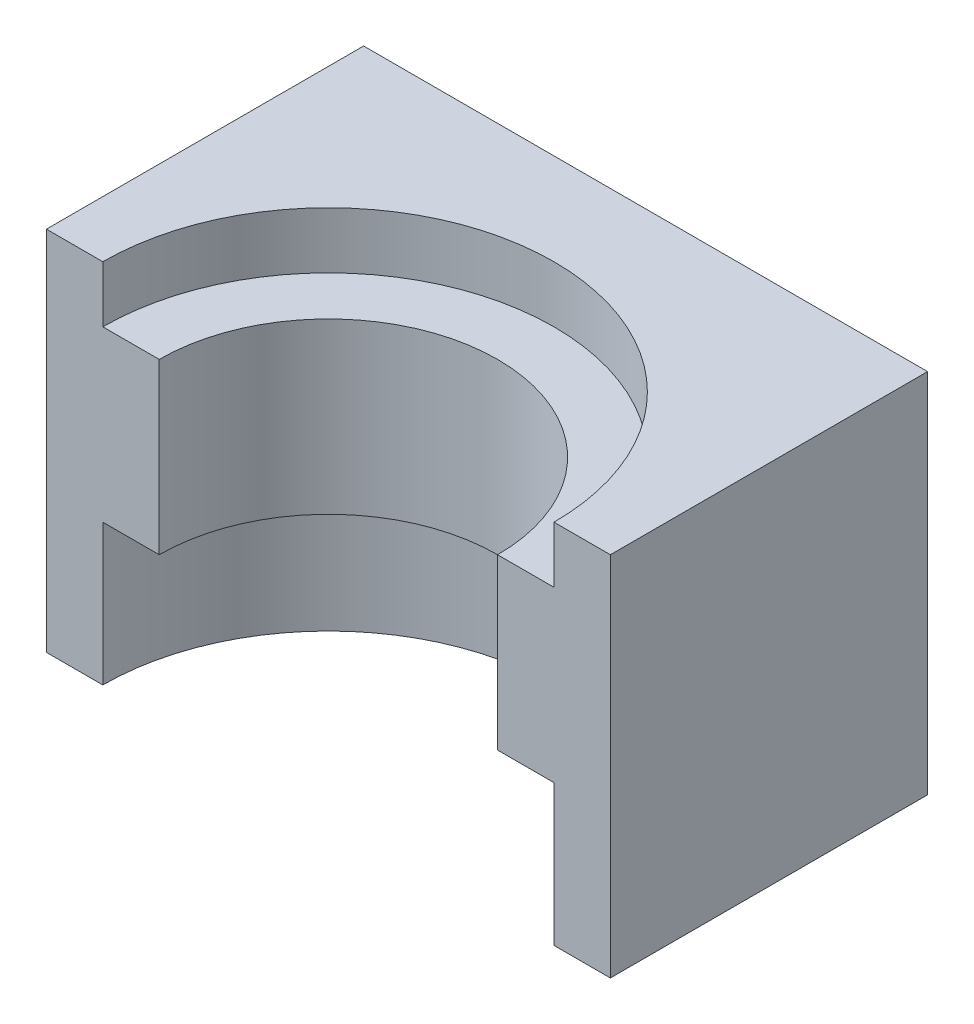
ISO-10303-21;
HEADER;
FILE_DESCRIPTION(('STEP AP214'),'2;1');
FILE_NAME('part.step','',(''),(''),'','','');
FILE_SCHEMA(('AUTOMOTIVE_DESIGN { 1 0 10303 214 1 1 1 1 }'));
ENDSEC;
DATA;
#1=APPLICATION_CONTEXT('core data for automotive mechanical design processes');
#2=APPLICATION_PROTOCOL_DEFINITION('international standard','automotive_design',2000,#1);
#3=PRODUCT_CONTEXT('',#1,'mechanical');
#4=PRODUCT('Part','Part','',(#3));
#5=PRODUCT_RELATED_PRODUCT_CATEGORY('part','',(#4));
#6=PRODUCT_DEFINITION_FORMATION('','',#4);
#7=PRODUCT_DEFINITION_CONTEXT('part definition',#1,'design');
#8=PRODUCT_DEFINITION('design','',#6,#7);
#9=PRODUCT_DEFINITION_SHAPE('','',#8);
#10=(LENGTH_UNIT() NAMED_UNIT(*) SI_UNIT(.MILLI.,.METRE.));
#11=(NAMED_UNIT(*) PLANE_ANGLE_UNIT() SI_UNIT($,.RADIAN.));
#12=(NAMED_UNIT(*) SI_UNIT($,.STERADIAN.) SOLID_ANGLE_UNIT());
#13=UNCERTAINTY_MEASURE_WITH_UNIT(LENGTH_MEASURE(1.E-05),#10,'distance_accuracy_value','');
#14=(GEOMETRIC_REPRESENTATION_CONTEXT(3) GLOBAL_UNCERTAINTY_ASSIGNED_CONTEXT((#13)) GLOBAL_UNIT_ASSIGNED_CONTEXT((#10,
#11,#12)) REPRESENTATION_CONTEXT('',''));
#15=CARTESIAN_POINT('',(0.,0.,0.));
#16=DIRECTION('',(0.,0.,1.));
#17=DIRECTION('',(1.,0.,0.));
#18=AXIS2_PLACEMENT_3D('',#15,#16,#17);
#19=CARTESIAN_POINT('',(10.,11.,-8.75));
#20=DIRECTION('',(0.,1.,0.));
#21=DIRECTION('',(0.,0.,1.));
#22=AXIS2_PLACEMENT_3D('',#19,#20,#21);
#23=PLANE('',#22);
#24=CARTESIAN_POINT('',(10.,11.,-8.75));
#25=DIRECTION('',(0.,-1.,0.));
#26=DIRECTION('',(0.,0.,1.));
#27=AXIS2_PLACEMENT_3D('',#24,#25,#26);
#28=CIRCLE('',#27,8.);
#29=CARTESIAN_POINT('',(2.,11.,-8.75));
#30=VERTEX_POINT('',#29);
#31=CARTESIAN_POINT('',(18.,11.,-8.75));
#32=VERTEX_POINT('',#31);
#33=EDGE_CURVE('E50',#30,#32,#28,.T.);
#34=ORIENTED_EDGE('',*,*,#33,.F.);
#35=DIRECTION('',(1.,0.,0.));
#36=VECTOR('',#35,1.);
#37=CARTESIAN_POINT('',(0.,11.,-8.75));
#38=LINE('',#37,#36);
#39=CARTESIAN_POINT('',(4.,11.,-8.75));
#40=VERTEX_POINT('',#39);
#41=EDGE_CURVE('E147',#30,#40,#38,.T.);
#42=ORIENTED_EDGE('',*,*,#41,.T.);
#43=CARTESIAN_POINT('',(10.,11.,-8.75));
#44=DIRECTION('',(0.,-1.,0.));
#45=DIRECTION('',(0.,0.,1.));
#46=AXIS2_PLACEMENT_3D('',#43,#44,#45);
#47=CIRCLE('',#46,6.);
#48=CARTESIAN_POINT('',(16.,11.,-8.75));
#49=VERTEX_POINT('',#48);
#50=EDGE_CURVE('E155',#40,#49,#47,.T.);
#51=ORIENTED_EDGE('',*,*,#50,.T.);
#52=DIRECTION('',(1.,0.,0.));
#53=VECTOR('',#52,1.);
#54=CARTESIAN_POINT('',(16.,11.,-8.75));
#55=LINE('',#54,#53);
#56=EDGE_CURVE('E143',#49,#32,#55,.T.);
#57=ORIENTED_EDGE('',*,*,#56,.T.);
#58=EDGE_LOOP('',(#34,#42,#51,#57));
#59=FACE_BOUND('',#58,.T.);
#60=ADVANCED_FACE('F35',(#59),#23,.T.);
#61=CARTESIAN_POINT('',(10.,5.,-8.75));
#62=DIRECTION('',(0.,-1.,0.));
#63=DIRECTION('',(0.,0.,-1.));
#64=AXIS2_PLACEMENT_3D('',#61,#62,#63);
#65=CYLINDRICAL_SURFACE('',#64,8.);
#66=CARTESIAN_POINT('',(10.,0.,-8.75));
#67=DIRECTION('',(0.,-1.,0.));
#68=DIRECTION('',(0.,0.,1.));
#69=AXIS2_PLACEMENT_3D('',#66,#67,#68);
#70=CIRCLE('',#69,8.);
#71=CARTESIAN_POINT('',(2.,0.,-8.75));
#72=VERTEX_POINT('',#71);
#73=CARTESIAN_POINT('',(18.,0.,-8.75));
#74=VERTEX_POINT('',#73);
#75=EDGE_CURVE('E107',#72,#74,#70,.T.);
#76=ORIENTED_EDGE('',*,*,#75,.T.);
#77=DIRECTION('',(0.,-1.,0.));
#78=VECTOR('',#77,1.);
#79=CARTESIAN_POINT('',(18.,5.,-8.75));
#80=LINE('',#79,#78);
#81=CARTESIAN_POINT('',(18.,5.,-8.75));
#82=VERTEX_POINT('',#81);
#83=EDGE_CURVE('E11',#82,#74,#80,.T.);
#84=ORIENTED_EDGE('',*,*,#83,.F.);
#85=CARTESIAN_POINT('',(10.,5.,-8.75));
#86=DIRECTION('',(0.,-1.,0.));
#87=DIRECTION('',(0.,0.,1.));
#88=AXIS2_PLACEMENT_3D('',#85,#86,#87);
#89=CIRCLE('',#88,8.);
#90=CARTESIAN_POINT('',(2.,5.,-8.75));
#91=VERTEX_POINT('',#90);
#92=EDGE_CURVE('E108',#91,#82,#89,.T.);
#93=ORIENTED_EDGE('',*,*,#92,.F.);
#94=DIRECTION('',(0.,-1.,0.));
#95=VECTOR('',#94,1.);
#96=CARTESIAN_POINT('',(2.,5.,-8.75));
#97=LINE('',#96,#95);
#98=EDGE_CURVE('E59',#91,#72,#97,.T.);
#99=ORIENTED_EDGE('',*,*,#98,.T.);
#100=EDGE_LOOP('',(#76,#84,#93,#99));
#101=FACE_BOUND('',#100,.T.);
#102=ADVANCED_FACE('F37',(#101),#65,.F.);
#103=CARTESIAN_POINT('',(18.,5.,-8.75));
#104=DIRECTION('',(0.,0.,-1.));
#105=DIRECTION('',(-1.,0.,0.));
#106=AXIS2_PLACEMENT_3D('',#103,#104,#105);
#107=PLANE('',#106);
#108=DIRECTION('',(1.,0.,0.));
#109=VECTOR('',#108,1.);
#110=CARTESIAN_POINT('',(18.,0.,-8.75));
#111=LINE('',#110,#109);
#112=CARTESIAN_POINT('',(20.,0.,-8.75));
#113=VERTEX_POINT('',#112);
#114=EDGE_CURVE('E132',#74,#113,#111,.T.);
#115=ORIENTED_EDGE('',*,*,#114,.T.);
#116=DIRECTION('',(0.,-1.,0.));
#117=VECTOR('',#116,1.);
#118=CARTESIAN_POINT('',(20.,5.,-8.75));
#119=LINE('',#118,#117);
#120=CARTESIAN_POINT('',(20.,13.,-8.75));
#121=VERTEX_POINT('',#120);
#122=EDGE_CURVE('E43',#121,#113,#119,.T.);
#123=ORIENTED_EDGE('',*,*,#122,.F.);
#124=DIRECTION('',(1.,0.,0.));
#125=VECTOR('',#124,1.);
#126=CARTESIAN_POINT('',(18.,13.,-8.75));
#127=LINE('',#126,#125);
#128=CARTESIAN_POINT('',(18.,13.,-8.75));
#129=VERTEX_POINT('',#128);
#130=EDGE_CURVE('E170',#129,#121,#127,.T.);
#131=ORIENTED_EDGE('',*,*,#130,.F.);
#132=DIRECTION('',(0.,-1.,0.));
#133=VECTOR('',#132,1.);
#134=CARTESIAN_POINT('',(18.,13.,-8.75));
#135=LINE('',#134,#133);
#136=EDGE_CURVE('E161',#129,#32,#135,.T.);
#137=ORIENTED_EDGE('',*,*,#136,.T.);
#138=ORIENTED_EDGE('',*,*,#56,.F.);
#139=DIRECTION('',(0.,-1.,0.));
#140=VECTOR('',#139,1.);
#141=CARTESIAN_POINT('',(16.,11.,-8.75));
#142=LINE('',#141,#140);
#143=CARTESIAN_POINT('',(16.,5.,-8.75));
#144=VERTEX_POINT('',#143);
#145=EDGE_CURVE('E140',#49,#144,#142,.T.);
#146=ORIENTED_EDGE('',*,*,#145,.T.);
#147=DIRECTION('',(1.,0.,0.));
#148=VECTOR('',#147,1.);
#149=CARTESIAN_POINT('',(16.,5.,-8.75));
#150=LINE('',#149,#148);
#151=EDGE_CURVE('E144',#144,#82,#150,.T.);
#152=ORIENTED_EDGE('',*,*,#151,.T.);
#153=ORIENTED_EDGE('',*,*,#83,.T.);
#154=EDGE_LOOP('',(#115,#123,#131,#137,#138,#146,#152,#153));
#155=FACE_BOUND('',#154,.T.);
#156=ADVANCED_FACE('F206',(#155),#107,.F.);
#157=CARTESIAN_POINT('',(20.,5.,-8.75));
#158=DIRECTION('',(-1.,0.,0.));
#159=DIRECTION('',(0.,0.,1.));
#160=AXIS2_PLACEMENT_3D('',#157,#158,#159);
#161=PLANE('',#160);
#162=DIRECTION('',(0.,0.,-1.));
#163=VECTOR('',#162,1.);
#164=CARTESIAN_POINT('',(20.,0.,-8.75));
#165=LINE('',#164,#163);
#166=CARTESIAN_POINT('',(20.,0.,-20.));
#167=VERTEX_POINT('',#166);
#168=EDGE_CURVE('E125',#113,#167,#165,.T.);
#169=ORIENTED_EDGE('',*,*,#168,.T.);
#170=DIRECTION('',(0.,-1.,0.));
#171=VECTOR('',#170,1.);
#172=CARTESIAN_POINT('',(20.,5.,-20.));
#173=LINE('',#172,#171);
#174=CARTESIAN_POINT('',(20.,13.,-20.));
#175=VERTEX_POINT('',#174);
#176=EDGE_CURVE('E116',#175,#167,#173,.T.);
#177=ORIENTED_EDGE('',*,*,#176,.F.);
#178=DIRECTION('',(0.,0.,-1.));
#179=VECTOR('',#178,1.);
#180=CARTESIAN_POINT('',(20.,13.,-20.));
#181=LINE('',#180,#179);
#182=EDGE_CURVE('E128',#121,#175,#181,.T.);
#183=ORIENTED_EDGE('',*,*,#182,.F.);
#184=ORIENTED_EDGE('',*,*,#122,.T.);
#185=EDGE_LOOP('',(#169,#177,#183,#184));
#186=FACE_BOUND('',#185,.T.);
#187=ADVANCED_FACE('F123',(#186),#161,.F.);
#188=CARTESIAN_POINT('',(0.,5.,-20.));
#189=DIRECTION('',(0.,0.,1.));
#190=DIRECTION('',(1.,0.,0.));
#191=AXIS2_PLACEMENT_3D('',#188,#189,#190);
#192=PLANE('',#191);
#193=DIRECTION('',(-1.,0.,0.));
#194=VECTOR('',#193,1.);
#195=CARTESIAN_POINT('',(0.,0.,-20.));
#196=LINE('',#195,#194);
#197=CARTESIAN_POINT('',(0.,0.,-20.));
#198=VERTEX_POINT('',#197);
#199=EDGE_CURVE('E96',#167,#198,#196,.T.);
#200=ORIENTED_EDGE('',*,*,#199,.T.);
#201=DIRECTION('',(0.,-1.,0.));
#202=VECTOR('',#201,1.);
#203=CARTESIAN_POINT('',(0.,5.,-20.));
#204=LINE('',#203,#202);
#205=CARTESIAN_POINT('',(0.,13.,-20.));
#206=VERTEX_POINT('',#205);
#207=EDGE_CURVE('E91',#206,#198,#204,.T.);
#208=ORIENTED_EDGE('',*,*,#207,.F.);
#209=DIRECTION('',(-1.,0.,0.));
#210=VECTOR('',#209,1.);
#211=CARTESIAN_POINT('',(0.,13.,-20.));
#212=LINE('',#211,#210);
#213=EDGE_CURVE('E164',#175,#206,#212,.T.);
#214=ORIENTED_EDGE('',*,*,#213,.F.);
#215=ORIENTED_EDGE('',*,*,#176,.T.);
#216=EDGE_LOOP('',(#200,#208,#214,#215));
#217=FACE_BOUND('',#216,.T.);
#218=ADVANCED_FACE('F232',(#217),#192,.F.);
#219=CARTESIAN_POINT('',(0.,5.,-8.75));
#220=DIRECTION('',(1.,0.,0.));
#221=DIRECTION('',(0.,0.,-1.));
#222=AXIS2_PLACEMENT_3D('',#219,#220,#221);
#223=PLANE('',#222);
#224=DIRECTION('',(0.,0.,1.));
#225=VECTOR('',#224,1.);
#226=CARTESIAN_POINT('',(0.,0.,-8.75));
#227=LINE('',#226,#225);
#228=CARTESIAN_POINT('',(0.,0.,-8.75));
#229=VERTEX_POINT('',#228);
#230=EDGE_CURVE('E83',#198,#229,#227,.T.);
#231=ORIENTED_EDGE('',*,*,#230,.T.);
#232=DIRECTION('',(0.,-1.,0.));
#233=VECTOR('',#232,1.);
#234=CARTESIAN_POINT('',(0.,5.,-8.75));
#235=LINE('',#234,#233);
#236=CARTESIAN_POINT('',(0.,13.,-8.75));
#237=VERTEX_POINT('',#236);
#238=EDGE_CURVE('E88',#237,#229,#235,.T.);
#239=ORIENTED_EDGE('',*,*,#238,.F.);
#240=DIRECTION('',(0.,0.,1.));
#241=VECTOR('',#240,1.);
#242=CARTESIAN_POINT('',(0.,13.,-20.));
#243=LINE('',#242,#241);
#244=EDGE_CURVE('E166',#206,#237,#243,.T.);
#245=ORIENTED_EDGE('',*,*,#244,.F.);
#246=ORIENTED_EDGE('',*,*,#207,.T.);
#247=EDGE_LOOP('',(#231,#239,#245,#246));
#248=FACE_BOUND('',#247,.T.);
#249=ADVANCED_FACE('F85',(#248),#223,.F.);
#250=CARTESIAN_POINT('',(0.,5.,-8.75));
#251=DIRECTION('',(0.,0.,-1.));
#252=DIRECTION('',(-1.,0.,0.));
#253=AXIS2_PLACEMENT_3D('',#250,#251,#252);
#254=PLANE('',#253);
#255=DIRECTION('',(1.,0.,0.));
#256=VECTOR('',#255,1.);
#257=CARTESIAN_POINT('',(0.,0.,-8.75));
#258=LINE('',#257,#256);
#259=EDGE_CURVE('E95',#229,#72,#258,.T.);
#260=ORIENTED_EDGE('',*,*,#259,.T.);
#261=ORIENTED_EDGE('',*,*,#98,.F.);
#262=DIRECTION('',(1.,0.,0.));
#263=VECTOR('',#262,1.);
#264=CARTESIAN_POINT('',(0.,5.,-8.75));
#265=LINE('',#264,#263);
#266=CARTESIAN_POINT('',(4.,5.,-8.75));
#267=VERTEX_POINT('',#266);
#268=EDGE_CURVE('E151',#91,#267,#265,.T.);
#269=ORIENTED_EDGE('',*,*,#268,.T.);
#270=DIRECTION('',(0.,-1.,0.));
#271=VECTOR('',#270,1.);
#272=CARTESIAN_POINT('',(4.,11.,-8.75));
#273=LINE('',#272,#271);
#274=EDGE_CURVE('E136',#40,#267,#273,.T.);
#275=ORIENTED_EDGE('',*,*,#274,.F.);
#276=ORIENTED_EDGE('',*,*,#41,.F.);
#277=DIRECTION('',(0.,-1.,0.));
#278=VECTOR('',#277,1.);
#279=CARTESIAN_POINT('',(2.,13.,-8.75));
#280=LINE('',#279,#278);
#281=CARTESIAN_POINT('',(2.,13.,-8.75));
#282=VERTEX_POINT('',#281);
#283=EDGE_CURVE('E153',#282,#30,#280,.T.);
#284=ORIENTED_EDGE('',*,*,#283,.F.);
#285=DIRECTION('',(1.,0.,0.));
#286=VECTOR('',#285,1.);
#287=CARTESIAN_POINT('',(0.,13.,-8.75));
#288=LINE('',#287,#286);
#289=EDGE_CURVE('E101',#237,#282,#288,.T.);
#290=ORIENTED_EDGE('',*,*,#289,.F.);
#291=ORIENTED_EDGE('',*,*,#238,.T.);
#292=EDGE_LOOP('',(#260,#261,#269,#275,#276,#284,#290,#291));
#293=FACE_BOUND('',#292,.T.);
#294=ADVANCED_FACE('F98',(#293),#254,.F.);
#295=CARTESIAN_POINT('',(10.,0.,-8.75));
#296=DIRECTION('',(0.,1.,0.));
#297=DIRECTION('',(0.,0.,1.));
#298=AXIS2_PLACEMENT_3D('',#295,#296,#297);
#299=PLANE('',#298);
#300=ORIENTED_EDGE('',*,*,#75,.F.);
#301=ORIENTED_EDGE('',*,*,#259,.F.);
#302=ORIENTED_EDGE('',*,*,#230,.F.);
#303=ORIENTED_EDGE('',*,*,#199,.F.);
#304=ORIENTED_EDGE('',*,*,#168,.F.);
#305=ORIENTED_EDGE('',*,*,#114,.F.);
#306=EDGE_LOOP('',(#300,#301,#302,#303,#304,#305));
#307=FACE_BOUND('',#306,.T.);
#308=ADVANCED_FACE('F105',(#307),#299,.F.);
#309=CARTESIAN_POINT('',(10.,5.,-8.75));
#310=DIRECTION('',(0.,1.,0.));
#311=DIRECTION('',(0.,0.,1.));
#312=AXIS2_PLACEMENT_3D('',#309,#310,#311);
#313=PLANE('',#312);
#314=ORIENTED_EDGE('',*,*,#268,.F.);
#315=ORIENTED_EDGE('',*,*,#92,.T.);
#316=ORIENTED_EDGE('',*,*,#151,.F.);
#317=CARTESIAN_POINT('',(10.,5.,-8.75));
#318=DIRECTION('',(0.,-1.,0.));
#319=DIRECTION('',(0.,0.,1.));
#320=AXIS2_PLACEMENT_3D('',#317,#318,#319);
#321=CIRCLE('',#320,6.);
#322=EDGE_CURVE('E148',#267,#144,#321,.T.);
#323=ORIENTED_EDGE('',*,*,#322,.F.);
#324=EDGE_LOOP('',(#314,#315,#316,#323));
#325=FACE_BOUND('',#324,.T.);
#326=ADVANCED_FACE('F207',(#325),#313,.F.);
#327=CARTESIAN_POINT('',(10.,11.,-8.75));
#328=DIRECTION('',(0.,-1.,0.));
#329=DIRECTION('',(0.,0.,-1.));
#330=AXIS2_PLACEMENT_3D('',#327,#328,#329);
#331=CYLINDRICAL_SURFACE('',#330,6.);
#332=ORIENTED_EDGE('',*,*,#322,.T.);
#333=ORIENTED_EDGE('',*,*,#145,.F.);
#334=ORIENTED_EDGE('',*,*,#50,.F.);
#335=ORIENTED_EDGE('',*,*,#274,.T.);
#336=EDGE_LOOP('',(#332,#333,#334,#335));
#337=FACE_BOUND('',#336,.T.);
#338=ADVANCED_FACE('F199',(#337),#331,.F.);
#339=CARTESIAN_POINT('',(10.,13.,-8.75));
#340=DIRECTION('',(0.,-1.,0.));
#341=DIRECTION('',(0.,0.,-1.));
#342=AXIS2_PLACEMENT_3D('',#339,#340,#341);
#343=CYLINDRICAL_SURFACE('',#342,8.);
#344=ORIENTED_EDGE('',*,*,#33,.T.);
#345=ORIENTED_EDGE('',*,*,#136,.F.);
#346=CARTESIAN_POINT('',(10.,13.,-8.75));
#347=DIRECTION('',(0.,-1.,0.));
#348=DIRECTION('',(0.,0.,1.));
#349=AXIS2_PLACEMENT_3D('',#346,#347,#348);
#350=CIRCLE('',#349,8.);
#351=EDGE_CURVE('E172',#282,#129,#350,.T.);
#352=ORIENTED_EDGE('',*,*,#351,.F.);
#353=ORIENTED_EDGE('',*,*,#283,.T.);
#354=EDGE_LOOP('',(#344,#345,#352,#353));
#355=FACE_BOUND('',#354,.T.);
#356=ADVANCED_FACE('F220',(#355),#343,.F.);
#357=CARTESIAN_POINT('',(10.,13.,-8.75));
#358=DIRECTION('',(0.,1.,0.));
#359=DIRECTION('',(0.,0.,1.));
#360=AXIS2_PLACEMENT_3D('',#357,#358,#359);
#361=PLANE('',#360);
#362=ORIENTED_EDGE('',*,*,#244,.T.);
#363=ORIENTED_EDGE('',*,*,#289,.T.);
#364=ORIENTED_EDGE('',*,*,#351,.T.);
#365=ORIENTED_EDGE('',*,*,#130,.T.);
#366=ORIENTED_EDGE('',*,*,#182,.T.);
#367=ORIENTED_EDGE('',*,*,#213,.T.);
#368=EDGE_LOOP('',(#362,#363,#364,#365,#366,#367));
#369=FACE_BOUND('',#368,.T.);
#370=ADVANCED_FACE('F177',(#369),#361,.T.);
#371=CLOSED_SHELL('',(#60,#102,#156,#187,#218,#249,#294,#308,#326,#338,#356,#370));
#372=MANIFOLD_SOLID_BREP('B2',#371);
#373=ADVANCED_BREP_SHAPE_REPRESENTATION('',(#18,#372),#14);
#374=SHAPE_DEFINITION_REPRESENTATION(#9,#373);
ENDSEC;
END-ISO-10303-21;
